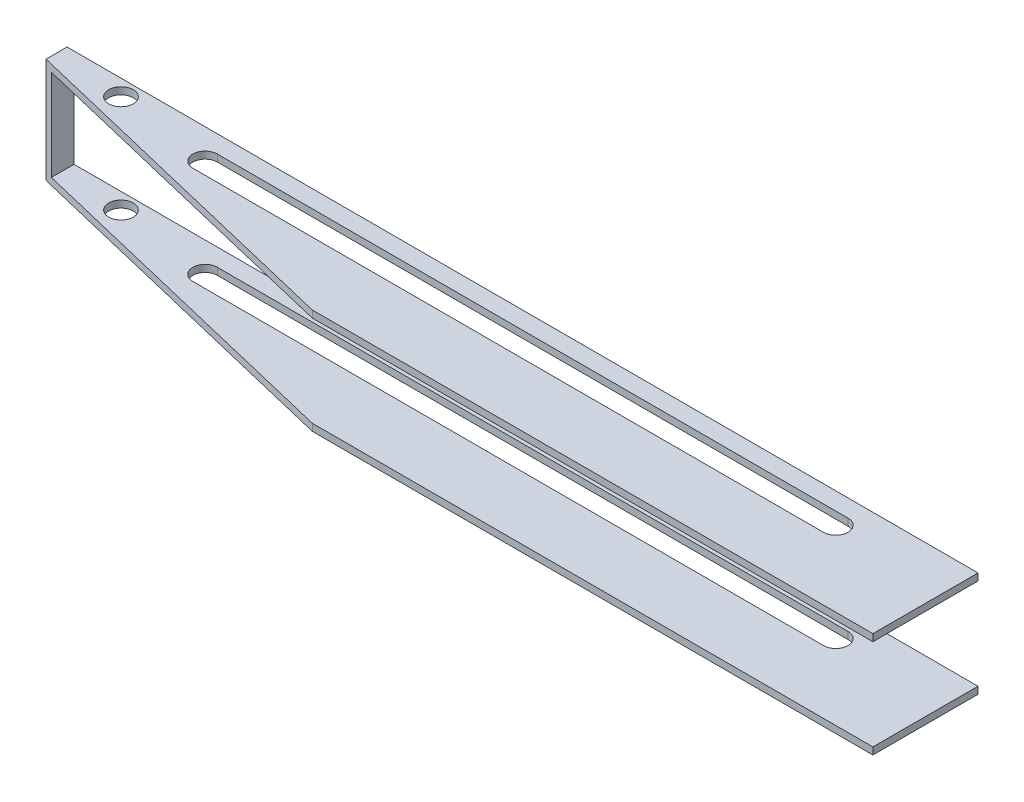
ISO-10303-21;
HEADER;
FILE_DESCRIPTION(('STEP AP214'),'2;1');
FILE_NAME('part.step','',(''),(''),'','','');
FILE_SCHEMA(('AUTOMOTIVE_DESIGN { 1 0 10303 214 1 1 1 1 }'));
ENDSEC;
DATA;
#1=APPLICATION_CONTEXT('core data for automotive mechanical design processes');
#2=APPLICATION_PROTOCOL_DEFINITION('international standard','automotive_design',2000,#1);
#3=PRODUCT_CONTEXT('',#1,'mechanical');
#4=PRODUCT('Part','Part','',(#3));
#5=PRODUCT_RELATED_PRODUCT_CATEGORY('part','',(#4));
#6=PRODUCT_DEFINITION_FORMATION('','',#4);
#7=PRODUCT_DEFINITION_CONTEXT('part definition',#1,'design');
#8=PRODUCT_DEFINITION('design','',#6,#7);
#9=PRODUCT_DEFINITION_SHAPE('','',#8);
#10=(LENGTH_UNIT() NAMED_UNIT(*) SI_UNIT(.MILLI.,.METRE.));
#11=(NAMED_UNIT(*) PLANE_ANGLE_UNIT() SI_UNIT($,.RADIAN.));
#12=(NAMED_UNIT(*) SI_UNIT($,.STERADIAN.) SOLID_ANGLE_UNIT());
#13=UNCERTAINTY_MEASURE_WITH_UNIT(LENGTH_MEASURE(1.E-05),#10,'distance_accuracy_value','');
#14=(GEOMETRIC_REPRESENTATION_CONTEXT(3) GLOBAL_UNCERTAINTY_ASSIGNED_CONTEXT((#13)) GLOBAL_UNIT_ASSIGNED_CONTEXT((#10,
#11,#12)) REPRESENTATION_CONTEXT('',''));
#15=CARTESIAN_POINT('',(0.,0.,0.));
#16=DIRECTION('',(0.,0.,1.));
#17=DIRECTION('',(1.,0.,0.));
#18=AXIS2_PLACEMENT_3D('',#15,#16,#17);
#19=CARTESIAN_POINT('',(0.,0.,0.));
#20=DIRECTION('',(0.,0.,-1.));
#21=DIRECTION('',(-1.,0.,0.));
#22=AXIS2_PLACEMENT_3D('',#19,#20,#21);
#23=PLANE('',#22);
#24=DIRECTION('',(-1.,0.,0.));
#25=VECTOR('',#24,1.);
#26=CARTESIAN_POINT('',(-60.5374077976817,-1.85985247629088,0.));
#27=LINE('',#26,#25);
#28=CARTESIAN_POINT('',(69.4625922023183,-1.85985247629088,0.));
#29=VERTEX_POINT('',#28);
#30=CARTESIAN_POINT('',(-10.5374077976817,-1.85985247629088,0.));
#31=VERTEX_POINT('',#30);
#32=EDGE_CURVE('E251',#29,#31,#27,.T.);
#33=ORIENTED_EDGE('',*,*,#32,.T.);
#34=DIRECTION('',(0.,-1.,0.));
#35=VECTOR('',#34,1.);
#36=CARTESIAN_POINT('',(-10.5374077976817,0.,0.));
#37=LINE('',#36,#35);
#38=CARTESIAN_POINT('',(-10.5374077976817,-2.85985247629089,0.));
#39=VERTEX_POINT('',#38);
#40=EDGE_CURVE('E11',#31,#39,#37,.T.);
#41=ORIENTED_EDGE('',*,*,#40,.T.);
#42=DIRECTION('',(1.,0.,0.));
#43=VECTOR('',#42,1.);
#44=CARTESIAN_POINT('',(69.4625922023183,-2.85985247629088,0.));
#45=LINE('',#44,#43);
#46=CARTESIAN_POINT('',(69.4625922023183,-2.85985247629088,0.));
#47=VERTEX_POINT('',#46);
#48=EDGE_CURVE('E280',#39,#47,#45,.T.);
#49=ORIENTED_EDGE('',*,*,#48,.T.);
#50=DIRECTION('',(0.,1.,0.));
#51=VECTOR('',#50,1.);
#52=CARTESIAN_POINT('',(69.4625922023183,-1.85985247629088,0.));
#53=LINE('',#52,#51);
#54=EDGE_CURVE('E282',#47,#29,#53,.T.);
#55=ORIENTED_EDGE('',*,*,#54,.T.);
#56=EDGE_LOOP('',(#33,#41,#49,#55));
#57=FACE_BOUND('',#56,.T.);
#58=ADVANCED_FACE('F33',(#57),#23,.F.);
#59=CARTESIAN_POINT('',(-60.5374077976817,-16.8598524762909,-15.));
#60=DIRECTION('',(-1.,0.,0.));
#61=DIRECTION('',(0.,0.,1.));
#62=AXIS2_PLACEMENT_3D('',#59,#60,#61);
#63=PLANE('',#62);
#64=DIRECTION('',(0.,1.,0.));
#65=VECTOR('',#64,1.);
#66=CARTESIAN_POINT('',(-60.5374077976817,-16.8598524762909,-12.));
#67=LINE('',#66,#65);
#68=CARTESIAN_POINT('',(-60.5374077976817,-16.8598524762909,-12.));
#69=VERTEX_POINT('',#68);
#70=CARTESIAN_POINT('',(-60.5374077976817,-1.85985247629088,-12.));
#71=VERTEX_POINT('',#70);
#72=EDGE_CURVE('E236',#69,#71,#67,.T.);
#73=ORIENTED_EDGE('',*,*,#72,.T.);
#74=DIRECTION('',(0.,0.,1.));
#75=VECTOR('',#74,1.);
#76=CARTESIAN_POINT('',(-60.5374077976817,-1.85985247629088,-15.));
#77=LINE('',#76,#75);
#78=CARTESIAN_POINT('',(-60.5374077976817,-1.85985247629088,-15.));
#79=VERTEX_POINT('',#78);
#80=EDGE_CURVE('E41',#79,#71,#77,.T.);
#81=ORIENTED_EDGE('',*,*,#80,.F.);
#82=DIRECTION('',(0.,-1.,0.));
#83=VECTOR('',#82,1.);
#84=CARTESIAN_POINT('',(-60.5374077976817,-16.8598524762909,-15.));
#85=LINE('',#84,#83);
#86=CARTESIAN_POINT('',(-60.5374077976817,-16.8598524762909,-15.));
#87=VERTEX_POINT('',#86);
#88=EDGE_CURVE('E247',#79,#87,#85,.T.);
#89=ORIENTED_EDGE('',*,*,#88,.T.);
#90=DIRECTION('',(0.,0.,1.));
#91=VECTOR('',#90,1.);
#92=CARTESIAN_POINT('',(-60.5374077976817,-16.8598524762909,-15.));
#93=LINE('',#92,#91);
#94=EDGE_CURVE('E272',#87,#69,#93,.T.);
#95=ORIENTED_EDGE('',*,*,#94,.T.);
#96=EDGE_LOOP('',(#73,#81,#89,#95));
#97=FACE_BOUND('',#96,.T.);
#98=ADVANCED_FACE('F35',(#97),#63,.T.);
#99=CARTESIAN_POINT('',(-60.5374077976817,-1.85985247629088,-15.));
#100=DIRECTION('',(0.,1.,0.));
#101=DIRECTION('',(0.,0.,1.));
#102=AXIS2_PLACEMENT_3D('',#99,#100,#101);
#103=PLANE('',#102);
#104=CARTESIAN_POINT('',(53.4154018775789,-1.85985247629086,-10.75));
#105=DIRECTION('',(0.,-1.,0.));
#106=DIRECTION('',(1.,0.,0.));
#107=AXIS2_PLACEMENT_3D('',#104,#105,#106);
#108=CIRCLE('',#107,1.75);
#109=CARTESIAN_POINT('',(53.4154018775789,-1.85985247629086,-12.5));
#110=VERTEX_POINT('',#109);
#111=CARTESIAN_POINT('',(53.4154018775789,-1.85985247629086,-9.));
#112=VERTEX_POINT('',#111);
#113=EDGE_CURVE('E161',#110,#112,#108,.T.);
#114=ORIENTED_EDGE('',*,*,#113,.T.);
#115=DIRECTION('',(-1.,0.,0.));
#116=VECTOR('',#115,1.);
#117=CARTESIAN_POINT('',(53.4154018775789,-1.85985247629086,-9.));
#118=LINE('',#117,#116);
#119=CARTESIAN_POINT('',(-36.5845981224211,-1.85985247629088,-9.00000000000001));
#120=VERTEX_POINT('',#119);
#121=EDGE_CURVE('E170',#112,#120,#118,.T.);
#122=ORIENTED_EDGE('',*,*,#121,.T.);
#123=CARTESIAN_POINT('',(-36.5845981224211,-1.85985247629088,-10.75));
#124=DIRECTION('',(0.,-1.,0.));
#125=DIRECTION('',(1.,0.,0.));
#126=AXIS2_PLACEMENT_3D('',#123,#124,#125);
#127=CIRCLE('',#126,1.75);
#128=CARTESIAN_POINT('',(-36.5845981224211,-1.85985247629088,-12.5));
#129=VERTEX_POINT('',#128);
#130=EDGE_CURVE('E48',#120,#129,#127,.T.);
#131=ORIENTED_EDGE('',*,*,#130,.T.);
#132=DIRECTION('',(1.,0.,0.));
#133=VECTOR('',#132,1.);
#134=CARTESIAN_POINT('',(53.4154018775789,-1.85985247629086,-12.5));
#135=LINE('',#134,#133);
#136=EDGE_CURVE('E178',#129,#110,#135,.T.);
#137=ORIENTED_EDGE('',*,*,#136,.T.);
#138=EDGE_LOOP('',(#114,#122,#131,#137));
#139=FACE_BOUND('',#138,.T.);
#140=CARTESIAN_POINT('',(-50.5374077976817,-1.85985247629088,-12.7));
#141=DIRECTION('',(0.,1.,0.));
#142=DIRECTION('',(0.,0.,1.));
#143=AXIS2_PLACEMENT_3D('',#140,#141,#142);
#144=CIRCLE('',#143,1.75);
#145=CARTESIAN_POINT('',(-50.5374077976817,-1.85985247629088,-10.95));
#146=VERTEX_POINT('',#145);
#147=EDGE_CURVE('E218',#146,#146,#144,.T.);
#148=ORIENTED_EDGE('',*,*,#147,.F.);
#149=EDGE_LOOP('',(#148));
#150=FACE_BOUND('',#149,.T.);
#151=DIRECTION('',(-0.972387301980517,0.,-0.233372952475324));
#152=VECTOR('',#151,1.);
#153=CARTESIAN_POINT('',(-60.5374077976817,-1.85985247629088,-12.));
#154=LINE('',#153,#152);
#155=EDGE_CURVE('E230',#31,#71,#154,.T.);
#156=ORIENTED_EDGE('',*,*,#155,.F.);
#157=ORIENTED_EDGE('',*,*,#32,.F.);
#158=DIRECTION('',(0.,0.,1.));
#159=VECTOR('',#158,1.);
#160=CARTESIAN_POINT('',(69.4625922023183,-1.85985247629088,-15.));
#161=LINE('',#160,#159);
#162=CARTESIAN_POINT('',(69.4625922023183,-1.85985247629088,-15.));
#163=VERTEX_POINT('',#162);
#164=EDGE_CURVE('E289',#163,#29,#161,.T.);
#165=ORIENTED_EDGE('',*,*,#164,.F.);
#166=DIRECTION('',(-1.,0.,0.));
#167=VECTOR('',#166,1.);
#168=CARTESIAN_POINT('',(-60.5374077976817,-1.85985247629088,-15.));
#169=LINE('',#168,#167);
#170=EDGE_CURVE('E269',#163,#79,#169,.T.);
#171=ORIENTED_EDGE('',*,*,#170,.T.);
#172=ORIENTED_EDGE('',*,*,#80,.T.);
#173=EDGE_LOOP('',(#156,#157,#165,#171,#172));
#174=FACE_BOUND('',#173,.T.);
#175=ADVANCED_FACE('F175',(#139,#150,#174),#103,.T.);
#176=CARTESIAN_POINT('',(69.4625922023183,-1.85985247629088,-15.));
#177=DIRECTION('',(1.,0.,0.));
#178=DIRECTION('',(0.,0.,-1.));
#179=AXIS2_PLACEMENT_3D('',#176,#177,#178);
#180=PLANE('',#179);
#181=ORIENTED_EDGE('',*,*,#54,.F.);
#182=DIRECTION('',(0.,0.,1.));
#183=VECTOR('',#182,1.);
#184=CARTESIAN_POINT('',(69.4625922023183,-2.85985247629088,-15.));
#185=LINE('',#184,#183);
#186=CARTESIAN_POINT('',(69.4625922023183,-2.85985247629088,-15.));
#187=VERTEX_POINT('',#186);
#188=EDGE_CURVE('E291',#187,#47,#185,.T.);
#189=ORIENTED_EDGE('',*,*,#188,.F.);
#190=DIRECTION('',(0.,1.,0.));
#191=VECTOR('',#190,1.);
#192=CARTESIAN_POINT('',(69.4625922023183,-1.85985247629088,-15.));
#193=LINE('',#192,#191);
#194=EDGE_CURVE('E266',#187,#163,#193,.T.);
#195=ORIENTED_EDGE('',*,*,#194,.T.);
#196=ORIENTED_EDGE('',*,*,#164,.T.);
#197=EDGE_LOOP('',(#181,#189,#195,#196));
#198=FACE_BOUND('',#197,.T.);
#199=ADVANCED_FACE('F344',(#198),#180,.T.);
#200=CARTESIAN_POINT('',(69.4625922023183,-2.85985247629088,-15.));
#201=DIRECTION('',(0.,-1.,0.));
#202=DIRECTION('',(1.,0.,0.));
#203=AXIS2_PLACEMENT_3D('',#200,#201,#202);
#204=PLANE('',#203);
#205=CARTESIAN_POINT('',(53.4154018775789,-2.85985247629088,-10.75));
#206=DIRECTION('',(0.,-1.,0.));
#207=DIRECTION('',(1.,0.,0.));
#208=AXIS2_PLACEMENT_3D('',#205,#206,#207);
#209=CIRCLE('',#208,1.75);
#210=CARTESIAN_POINT('',(53.4154018775789,-2.85985247629088,-12.5));
#211=VERTEX_POINT('',#210);
#212=CARTESIAN_POINT('',(53.4154018775789,-2.85985247629088,-9.));
#213=VERTEX_POINT('',#212);
#214=EDGE_CURVE('E164',#211,#213,#209,.T.);
#215=ORIENTED_EDGE('',*,*,#214,.F.);
#216=DIRECTION('',(1.,0.,0.));
#217=VECTOR('',#216,1.);
#218=CARTESIAN_POINT('',(69.4625922023183,-2.85985247629088,-12.5));
#219=LINE('',#218,#217);
#220=CARTESIAN_POINT('',(-36.5845981224211,-2.85985247629089,-12.5));
#221=VERTEX_POINT('',#220);
#222=EDGE_CURVE('E213',#221,#211,#219,.T.);
#223=ORIENTED_EDGE('',*,*,#222,.F.);
#224=CARTESIAN_POINT('',(-36.5845981224211,-2.85985247629089,-10.75));
#225=DIRECTION('',(0.,-1.,0.));
#226=DIRECTION('',(1.,0.,0.));
#227=AXIS2_PLACEMENT_3D('',#224,#225,#226);
#228=CIRCLE('',#227,1.75);
#229=CARTESIAN_POINT('',(-36.5845981224211,-2.85985247629088,-9.00000000000001));
#230=VERTEX_POINT('',#229);
#231=EDGE_CURVE('E209',#230,#221,#228,.T.);
#232=ORIENTED_EDGE('',*,*,#231,.F.);
#233=DIRECTION('',(-1.,0.,0.));
#234=VECTOR('',#233,1.);
#235=CARTESIAN_POINT('',(69.4625922023183,-2.85985247629088,-9.));
#236=LINE('',#235,#234);
#237=EDGE_CURVE('E204',#213,#230,#236,.T.);
#238=ORIENTED_EDGE('',*,*,#237,.F.);
#239=EDGE_LOOP('',(#215,#223,#232,#238));
#240=FACE_BOUND('',#239,.T.);
#241=CARTESIAN_POINT('',(-50.5374077976817,-2.85985247629089,-12.7));
#242=DIRECTION('',(0.,-1.,0.));
#243=DIRECTION('',(1.,0.,0.));
#244=AXIS2_PLACEMENT_3D('',#241,#242,#243);
#245=CIRCLE('',#244,1.75);
#246=CARTESIAN_POINT('',(-50.5374077976817,-2.85985247629089,-10.95));
#247=VERTEX_POINT('',#246);
#248=EDGE_CURVE('E227',#247,#247,#245,.T.);
#249=ORIENTED_EDGE('',*,*,#248,.F.);
#250=EDGE_LOOP('',(#249));
#251=FACE_BOUND('',#250,.T.);
#252=DIRECTION('',(0.972387301980517,0.,0.233372952475324));
#253=VECTOR('',#252,1.);
#254=CARTESIAN_POINT('',(61.7016239723636,-2.85985247629088,17.3373676248109));
#255=LINE('',#254,#253);
#256=CARTESIAN_POINT('',(-59.5374077976817,-2.85985247629089,-11.76));
#257=VERTEX_POINT('',#256);
#258=EDGE_CURVE('E244',#257,#39,#255,.T.);
#259=ORIENTED_EDGE('',*,*,#258,.F.);
#260=DIRECTION('',(0.,0.,1.));
#261=VECTOR('',#260,1.);
#262=CARTESIAN_POINT('',(-59.5374077976817,-2.85985247629089,-15.));
#263=LINE('',#262,#261);
#264=CARTESIAN_POINT('',(-59.5374077976817,-2.85985247629089,-15.));
#265=VERTEX_POINT('',#264);
#266=EDGE_CURVE('E294',#265,#257,#263,.T.);
#267=ORIENTED_EDGE('',*,*,#266,.F.);
#268=DIRECTION('',(1.,0.,0.));
#269=VECTOR('',#268,1.);
#270=CARTESIAN_POINT('',(69.4625922023183,-2.85985247629088,-15.));
#271=LINE('',#270,#269);
#272=EDGE_CURVE('E263',#265,#187,#271,.T.);
#273=ORIENTED_EDGE('',*,*,#272,.T.);
#274=ORIENTED_EDGE('',*,*,#188,.T.);
#275=ORIENTED_EDGE('',*,*,#48,.F.);
#276=EDGE_LOOP('',(#259,#267,#273,#274,#275));
#277=FACE_BOUND('',#276,.T.);
#278=ADVANCED_FACE('F336',(#240,#251,#277),#204,.T.);
#279=CARTESIAN_POINT('',(-59.5374077976817,-2.85985247629089,-15.));
#280=DIRECTION('',(1.,0.,0.));
#281=DIRECTION('',(0.,1.,0.));
#282=AXIS2_PLACEMENT_3D('',#279,#280,#281);
#283=PLANE('',#282);
#284=DIRECTION('',(0.,1.,0.));
#285=VECTOR('',#284,1.);
#286=CARTESIAN_POINT('',(-59.5374077976817,-2.85985247629089,-11.76));
#287=LINE('',#286,#285);
#288=CARTESIAN_POINT('',(-59.5374077976817,-15.8598524762909,-11.76));
#289=VERTEX_POINT('',#288);
#290=EDGE_CURVE('E242',#289,#257,#287,.T.);
#291=ORIENTED_EDGE('',*,*,#290,.F.);
#292=DIRECTION('',(0.,0.,1.));
#293=VECTOR('',#292,1.);
#294=CARTESIAN_POINT('',(-59.5374077976817,-15.8598524762909,-15.));
#295=LINE('',#294,#293);
#296=CARTESIAN_POINT('',(-59.5374077976817,-15.8598524762909,-15.));
#297=VERTEX_POINT('',#296);
#298=EDGE_CURVE('E297',#297,#289,#295,.T.);
#299=ORIENTED_EDGE('',*,*,#298,.F.);
#300=DIRECTION('',(0.,1.,0.));
#301=VECTOR('',#300,1.);
#302=CARTESIAN_POINT('',(-59.5374077976817,-2.85985247629089,-15.));
#303=LINE('',#302,#301);
#304=EDGE_CURVE('E260',#297,#265,#303,.T.);
#305=ORIENTED_EDGE('',*,*,#304,.T.);
#306=ORIENTED_EDGE('',*,*,#266,.T.);
#307=EDGE_LOOP('',(#291,#299,#305,#306));
#308=FACE_BOUND('',#307,.T.);
#309=ADVANCED_FACE('F331',(#308),#283,.T.);
#310=CARTESIAN_POINT('',(-59.5374077976817,-15.8598524762909,-15.));
#311=DIRECTION('',(0.,1.,0.));
#312=DIRECTION('',(0.,0.,1.));
#313=AXIS2_PLACEMENT_3D('',#310,#311,#312);
#314=PLANE('',#313);
#315=CARTESIAN_POINT('',(53.4154018775789,-15.8598524762909,-10.75));
#316=DIRECTION('',(0.,1.,0.));
#317=DIRECTION('',(0.,0.,1.));
#318=AXIS2_PLACEMENT_3D('',#315,#316,#317);
#319=CIRCLE('',#318,1.75);
#320=CARTESIAN_POINT('',(53.4154018775789,-15.8598524762909,-9.));
#321=VERTEX_POINT('',#320);
#322=CARTESIAN_POINT('',(53.4154018775789,-15.8598524762909,-12.5));
#323=VERTEX_POINT('',#322);
#324=EDGE_CURVE('E215',#321,#323,#319,.T.);
#325=ORIENTED_EDGE('',*,*,#324,.F.);
#326=DIRECTION('',(1.,0.,0.));
#327=VECTOR('',#326,1.);
#328=CARTESIAN_POINT('',(-59.5374077976817,-15.8598524762909,-9.00000000000001));
#329=LINE('',#328,#327);
#330=CARTESIAN_POINT('',(-36.5845981224211,-15.8598524762909,-9.00000000000001));
#331=VERTEX_POINT('',#330);
#332=EDGE_CURVE('E196',#331,#321,#329,.T.);
#333=ORIENTED_EDGE('',*,*,#332,.F.);
#334=CARTESIAN_POINT('',(-36.5845981224211,-15.8598524762909,-10.75));
#335=DIRECTION('',(0.,1.,0.));
#336=DIRECTION('',(0.,0.,1.));
#337=AXIS2_PLACEMENT_3D('',#334,#335,#336);
#338=CIRCLE('',#337,1.75);
#339=CARTESIAN_POINT('',(-36.5845981224211,-15.8598524762909,-12.5));
#340=VERTEX_POINT('',#339);
#341=EDGE_CURVE('E206',#340,#331,#338,.T.);
#342=ORIENTED_EDGE('',*,*,#341,.F.);
#343=DIRECTION('',(-1.,0.,0.));
#344=VECTOR('',#343,1.);
#345=CARTESIAN_POINT('',(-59.5374077976817,-15.8598524762909,-12.5));
#346=LINE('',#345,#344);
#347=EDGE_CURVE('E211',#323,#340,#346,.T.);
#348=ORIENTED_EDGE('',*,*,#347,.F.);
#349=EDGE_LOOP('',(#325,#333,#342,#348));
#350=FACE_BOUND('',#349,.T.);
#351=CARTESIAN_POINT('',(-50.5374077976817,-15.8598524762909,-12.7));
#352=DIRECTION('',(0.,1.,0.));
#353=DIRECTION('',(0.,0.,1.));
#354=AXIS2_PLACEMENT_3D('',#351,#352,#353);
#355=CIRCLE('',#354,1.75);
#356=CARTESIAN_POINT('',(-50.5374077976817,-15.8598524762909,-10.95));
#357=VERTEX_POINT('',#356);
#358=EDGE_CURVE('E222',#357,#357,#355,.T.);
#359=ORIENTED_EDGE('',*,*,#358,.F.);
#360=EDGE_LOOP('',(#359));
#361=FACE_BOUND('',#360,.T.);
#362=DIRECTION('',(-0.972387301980517,0.,-0.233372952475324));
#363=VECTOR('',#362,1.);
#364=CARTESIAN_POINT('',(-60.2726574194669,-15.8598524762909,-11.9364599092284));
#365=LINE('',#364,#363);
#366=CARTESIAN_POINT('',(-10.5374077976817,-15.8598524762909,0.));
#367=VERTEX_POINT('',#366);
#368=EDGE_CURVE('E239',#367,#289,#365,.T.);
#369=ORIENTED_EDGE('',*,*,#368,.F.);
#370=DIRECTION('',(-1.,0.,0.));
#371=VECTOR('',#370,1.);
#372=CARTESIAN_POINT('',(-59.5374077976817,-15.8598524762909,0.));
#373=LINE('',#372,#371);
#374=CARTESIAN_POINT('',(69.4625922023182,-15.8598524762909,0.));
#375=VERTEX_POINT('',#374);
#376=EDGE_CURVE('E277',#375,#367,#373,.T.);
#377=ORIENTED_EDGE('',*,*,#376,.F.);
#378=DIRECTION('',(0.,0.,1.));
#379=VECTOR('',#378,1.);
#380=CARTESIAN_POINT('',(69.4625922023182,-15.8598524762909,-15.));
#381=LINE('',#380,#379);
#382=CARTESIAN_POINT('',(69.4625922023182,-15.8598524762909,-15.));
#383=VERTEX_POINT('',#382);
#384=EDGE_CURVE('E300',#383,#375,#381,.T.);
#385=ORIENTED_EDGE('',*,*,#384,.F.);
#386=DIRECTION('',(-1.,0.,0.));
#387=VECTOR('',#386,1.);
#388=CARTESIAN_POINT('',(-59.5374077976817,-15.8598524762909,-15.));
#389=LINE('',#388,#387);
#390=EDGE_CURVE('E257',#383,#297,#389,.T.);
#391=ORIENTED_EDGE('',*,*,#390,.T.);
#392=ORIENTED_EDGE('',*,*,#298,.T.);
#393=EDGE_LOOP('',(#369,#377,#385,#391,#392));
#394=FACE_BOUND('',#393,.T.);
#395=ADVANCED_FACE('F329',(#350,#361,#394),#314,.T.);
#396=CARTESIAN_POINT('',(69.4625922023182,-15.8598524762909,-15.));
#397=DIRECTION('',(1.,0.,0.));
#398=DIRECTION('',(0.,1.,0.));
#399=AXIS2_PLACEMENT_3D('',#396,#397,#398);
#400=PLANE('',#399);
#401=DIRECTION('',(0.,1.,0.));
#402=VECTOR('',#401,1.);
#403=CARTESIAN_POINT('',(69.4625922023182,-15.8598524762909,0.));
#404=LINE('',#403,#402);
#405=CARTESIAN_POINT('',(69.4625922023183,-16.8598524762909,0.));
#406=VERTEX_POINT('',#405);
#407=EDGE_CURVE('E274',#406,#375,#404,.T.);
#408=ORIENTED_EDGE('',*,*,#407,.F.);
#409=DIRECTION('',(0.,0.,1.));
#410=VECTOR('',#409,1.);
#411=CARTESIAN_POINT('',(69.4625922023183,-16.8598524762909,-15.));
#412=LINE('',#411,#410);
#413=CARTESIAN_POINT('',(69.4625922023183,-16.8598524762909,-15.));
#414=VERTEX_POINT('',#413);
#415=EDGE_CURVE('E302',#414,#406,#412,.T.);
#416=ORIENTED_EDGE('',*,*,#415,.F.);
#417=DIRECTION('',(0.,1.,0.));
#418=VECTOR('',#417,1.);
#419=CARTESIAN_POINT('',(69.4625922023182,-15.8598524762909,-15.));
#420=LINE('',#419,#418);
#421=EDGE_CURVE('E254',#414,#383,#420,.T.);
#422=ORIENTED_EDGE('',*,*,#421,.T.);
#423=ORIENTED_EDGE('',*,*,#384,.T.);
#424=EDGE_LOOP('',(#408,#416,#422,#423));
#425=FACE_BOUND('',#424,.T.);
#426=ADVANCED_FACE('F319',(#425),#400,.T.);
#427=CARTESIAN_POINT('',(69.4625922023183,-16.8598524762909,-15.));
#428=DIRECTION('',(0.,-1.,0.));
#429=DIRECTION('',(1.,0.,0.));
#430=AXIS2_PLACEMENT_3D('',#427,#428,#429);
#431=PLANE('',#430);
#432=CARTESIAN_POINT('',(53.4154018775789,-16.8598524762909,-10.75));
#433=DIRECTION('',(0.,-1.,0.));
#434=DIRECTION('',(1.,0.,0.));
#435=AXIS2_PLACEMENT_3D('',#432,#433,#434);
#436=CIRCLE('',#435,1.75);
#437=CARTESIAN_POINT('',(53.4154018775789,-16.8598524762909,-12.5));
#438=VERTEX_POINT('',#437);
#439=CARTESIAN_POINT('',(53.4154018775789,-16.8598524762909,-9.));
#440=VERTEX_POINT('',#439);
#441=EDGE_CURVE('E187',#438,#440,#436,.T.);
#442=ORIENTED_EDGE('',*,*,#441,.F.);
#443=DIRECTION('',(1.,0.,0.));
#444=VECTOR('',#443,1.);
#445=CARTESIAN_POINT('',(53.4154018775789,-16.8598524762909,-12.5));
#446=LINE('',#445,#444);
#447=CARTESIAN_POINT('',(-36.5845981224211,-16.8598524762909,-12.5));
#448=VERTEX_POINT('',#447);
#449=EDGE_CURVE('E179',#448,#438,#446,.T.);
#450=ORIENTED_EDGE('',*,*,#449,.F.);
#451=CARTESIAN_POINT('',(-36.5845981224211,-16.8598524762909,-10.75));
#452=DIRECTION('',(0.,-1.,0.));
#453=DIRECTION('',(1.,0.,0.));
#454=AXIS2_PLACEMENT_3D('',#451,#452,#453);
#455=CIRCLE('',#454,1.75);
#456=CARTESIAN_POINT('',(-36.5845981224211,-16.8598524762909,-9.00000000000001));
#457=VERTEX_POINT('',#456);
#458=EDGE_CURVE('E182',#457,#448,#455,.T.);
#459=ORIENTED_EDGE('',*,*,#458,.F.);
#460=DIRECTION('',(-1.,0.,0.));
#461=VECTOR('',#460,1.);
#462=CARTESIAN_POINT('',(53.4154018775789,-16.8598524762909,-9.));
#463=LINE('',#462,#461);
#464=EDGE_CURVE('E189',#440,#457,#463,.T.);
#465=ORIENTED_EDGE('',*,*,#464,.F.);
#466=EDGE_LOOP('',(#442,#450,#459,#465));
#467=FACE_BOUND('',#466,.T.);
#468=CARTESIAN_POINT('',(-50.5374077976817,-16.8598524762909,-12.7));
#469=DIRECTION('',(0.,1.,0.));
#470=DIRECTION('',(0.,0.,1.));
#471=AXIS2_PLACEMENT_3D('',#468,#469,#470);
#472=CIRCLE('',#471,1.75);
#473=CARTESIAN_POINT('',(-50.5374077976817,-16.8598524762909,-10.95));
#474=VERTEX_POINT('',#473);
#475=EDGE_CURVE('E219',#474,#474,#472,.T.);
#476=ORIENTED_EDGE('',*,*,#475,.T.);
#477=EDGE_LOOP('',(#476));
#478=FACE_BOUND('',#477,.T.);
#479=DIRECTION('',(-0.972387301980517,0.,-0.233372952475324));
#480=VECTOR('',#479,1.);
#481=CARTESIAN_POINT('',(-60.5374077976817,-16.8598524762909,-12.));
#482=LINE('',#481,#480);
#483=CARTESIAN_POINT('',(-10.5374077976817,-16.8598524762909,0.));
#484=VERTEX_POINT('',#483);
#485=EDGE_CURVE('E231',#484,#69,#482,.T.);
#486=ORIENTED_EDGE('',*,*,#485,.T.);
#487=ORIENTED_EDGE('',*,*,#94,.F.);
#488=DIRECTION('',(1.,0.,0.));
#489=VECTOR('',#488,1.);
#490=CARTESIAN_POINT('',(69.4625922023183,-16.8598524762909,-15.));
#491=LINE('',#490,#489);
#492=EDGE_CURVE('E250',#87,#414,#491,.T.);
#493=ORIENTED_EDGE('',*,*,#492,.T.);
#494=ORIENTED_EDGE('',*,*,#415,.T.);
#495=DIRECTION('',(1.,0.,0.));
#496=VECTOR('',#495,1.);
#497=CARTESIAN_POINT('',(69.4625922023183,-16.8598524762909,0.));
#498=LINE('',#497,#496);
#499=EDGE_CURVE('E246',#484,#406,#498,.T.);
#500=ORIENTED_EDGE('',*,*,#499,.F.);
#501=EDGE_LOOP('',(#486,#487,#493,#494,#500));
#502=FACE_BOUND('',#501,.T.);
#503=ADVANCED_FACE('F309',(#467,#478,#502),#431,.T.);
#504=CARTESIAN_POINT('',(0.,0.,-15.));
#505=DIRECTION('',(0.,0.,-1.));
#506=DIRECTION('',(-1.,0.,0.));
#507=AXIS2_PLACEMENT_3D('',#504,#505,#506);
#508=PLANE('',#507);
#509=ORIENTED_EDGE('',*,*,#88,.F.);
#510=ORIENTED_EDGE('',*,*,#170,.F.);
#511=ORIENTED_EDGE('',*,*,#194,.F.);
#512=ORIENTED_EDGE('',*,*,#272,.F.);
#513=ORIENTED_EDGE('',*,*,#304,.F.);
#514=ORIENTED_EDGE('',*,*,#390,.F.);
#515=ORIENTED_EDGE('',*,*,#421,.F.);
#516=ORIENTED_EDGE('',*,*,#492,.F.);
#517=EDGE_LOOP('',(#509,#510,#511,#512,#513,#514,#515,#516));
#518=FACE_BOUND('',#517,.T.);
#519=ADVANCED_FACE('F313',(#518),#508,.T.);
#520=ORIENTED_EDGE('',*,*,#376,.T.);
#521=DIRECTION('',(0.,1.,0.));
#522=VECTOR('',#521,1.);
#523=CARTESIAN_POINT('',(-10.5374077976817,-16.8598524762909,0.));
#524=LINE('',#523,#522);
#525=EDGE_CURVE('E234',#484,#367,#524,.T.);
#526=ORIENTED_EDGE('',*,*,#525,.F.);
#527=ORIENTED_EDGE('',*,*,#499,.T.);
#528=ORIENTED_EDGE('',*,*,#407,.T.);
#529=EDGE_LOOP('',(#520,#526,#527,#528));
#530=FACE_BOUND('',#529,.T.);
#531=ADVANCED_FACE('F323',(#530),#23,.F.);
#532=CARTESIAN_POINT('',(-60.5374077976817,-16.8598524762909,-12.));
#533=DIRECTION('',(0.233372952475324,0.,-0.972387301980517));
#534=DIRECTION('',(-0.972387301980517,0.,-0.233372952475324));
#535=AXIS2_PLACEMENT_3D('',#532,#533,#534);
#536=PLANE('',#535);
#537=ORIENTED_EDGE('',*,*,#258,.T.);
#538=ORIENTED_EDGE('',*,*,#40,.F.);
#539=ORIENTED_EDGE('',*,*,#155,.T.);
#540=ORIENTED_EDGE('',*,*,#72,.F.);
#541=ORIENTED_EDGE('',*,*,#485,.F.);
#542=ORIENTED_EDGE('',*,*,#525,.T.);
#543=ORIENTED_EDGE('',*,*,#368,.T.);
#544=ORIENTED_EDGE('',*,*,#290,.T.);
#545=EDGE_LOOP('',(#537,#538,#539,#540,#541,#542,#543,#544));
#546=FACE_BOUND('',#545,.T.);
#547=ADVANCED_FACE('F326',(#546),#536,.F.);
#548=CARTESIAN_POINT('',(-50.5374077976817,-16.8598524762909,-12.7));
#549=DIRECTION('',(0.,1.,0.));
#550=DIRECTION('',(0.,0.,1.));
#551=AXIS2_PLACEMENT_3D('',#548,#549,#550);
#552=CYLINDRICAL_SURFACE('',#551,1.75);
#553=CARTESIAN_POINT('',(-50.5374077976817,-15.8598524762909,-10.95));
#554=CARTESIAN_POINT('',(-50.5374077976817,-15.8702691429575,-10.95));
#555=CARTESIAN_POINT('',(-50.5374077976817,-15.8806858096242,-10.95));
#556=CARTESIAN_POINT('',(-50.5374077976817,-15.9015191429575,-10.95));
#557=CARTESIAN_POINT('',(-50.5374077976817,-15.9119358096242,-10.95));
#558=CARTESIAN_POINT('',(-50.5374077976817,-15.9327691429575,-10.95));
#559=CARTESIAN_POINT('',(-50.5374077976817,-15.9431858096242,-10.95));
#560=CARTESIAN_POINT('',(-50.5374077976817,-15.9640191429575,-10.95));
#561=CARTESIAN_POINT('',(-50.5374077976817,-15.9744358096242,-10.95));
#562=CARTESIAN_POINT('',(-50.5374077976817,-15.9952691429575,-10.95));
#563=CARTESIAN_POINT('',(-50.5374077976817,-16.0056858096242,-10.95));
#564=CARTESIAN_POINT('',(-50.5374077976817,-16.0265191429575,-10.95));
#565=CARTESIAN_POINT('',(-50.5374077976817,-16.0369358096242,-10.95));
#566=CARTESIAN_POINT('',(-50.5374077976817,-16.0577691429575,-10.95));
#567=CARTESIAN_POINT('',(-50.5374077976817,-16.0681858096242,-10.95));
#568=CARTESIAN_POINT('',(-50.5374077976817,-16.0890191429575,-10.95));
#569=CARTESIAN_POINT('',(-50.5374077976817,-16.0994358096242,-10.95));
#570=CARTESIAN_POINT('',(-50.5374077976817,-16.1202691429575,-10.95));
#571=CARTESIAN_POINT('',(-50.5374077976817,-16.1306858096242,-10.95));
#572=CARTESIAN_POINT('',(-50.5374077976817,-16.1515191429575,-10.95));
#573=CARTESIAN_POINT('',(-50.5374077976817,-16.1619358096242,-10.95));
#574=CARTESIAN_POINT('',(-50.5374077976817,-16.1827691429575,-10.95));
#575=CARTESIAN_POINT('',(-50.5374077976817,-16.1931858096242,-10.95));
#576=CARTESIAN_POINT('',(-50.5374077976817,-16.2140191429575,-10.95));
#577=CARTESIAN_POINT('',(-50.5374077976817,-16.2244358096242,-10.95));
#578=CARTESIAN_POINT('',(-50.5374077976817,-16.2452691429575,-10.95));
#579=CARTESIAN_POINT('',(-50.5374077976817,-16.2556858096242,-10.95));
#580=CARTESIAN_POINT('',(-50.5374077976817,-16.2765191429575,-10.95));
#581=CARTESIAN_POINT('',(-50.5374077976817,-16.2869358096242,-10.95));
#582=CARTESIAN_POINT('',(-50.5374077976817,-16.3077691429575,-10.95));
#583=CARTESIAN_POINT('',(-50.5374077976817,-16.3181858096242,-10.95));
#584=CARTESIAN_POINT('',(-50.5374077976817,-16.3390191429575,-10.95));
#585=CARTESIAN_POINT('',(-50.5374077976817,-16.3494358096242,-10.95));
#586=CARTESIAN_POINT('',(-50.5374077976817,-16.3702691429575,-10.95));
#587=CARTESIAN_POINT('',(-50.5374077976817,-16.3806858096242,-10.95));
#588=CARTESIAN_POINT('',(-50.5374077976817,-16.4015191429575,-10.95));
#589=CARTESIAN_POINT('',(-50.5374077976817,-16.4119358096242,-10.95));
#590=CARTESIAN_POINT('',(-50.5374077976817,-16.4327691429575,-10.95));
#591=CARTESIAN_POINT('',(-50.5374077976817,-16.4431858096242,-10.95));
#592=CARTESIAN_POINT('',(-50.5374077976817,-16.4640191429575,-10.95));
#593=CARTESIAN_POINT('',(-50.5374077976817,-16.4744358096242,-10.95));
#594=CARTESIAN_POINT('',(-50.5374077976817,-16.4952691429575,-10.95));
#595=CARTESIAN_POINT('',(-50.5374077976817,-16.5056858096242,-10.95));
#596=CARTESIAN_POINT('',(-50.5374077976817,-16.5265191429575,-10.95));
#597=CARTESIAN_POINT('',(-50.5374077976817,-16.5369358096242,-10.95));
#598=CARTESIAN_POINT('',(-50.5374077976817,-16.5577691429575,-10.95));
#599=CARTESIAN_POINT('',(-50.5374077976817,-16.5681858096242,-10.95));
#600=CARTESIAN_POINT('',(-50.5374077976817,-16.5890191429575,-10.95));
#601=CARTESIAN_POINT('',(-50.5374077976817,-16.5994358096242,-10.95));
#602=CARTESIAN_POINT('',(-50.5374077976817,-16.6202691429575,-10.95));
#603=CARTESIAN_POINT('',(-50.5374077976817,-16.6306858096242,-10.95));
#604=CARTESIAN_POINT('',(-50.5374077976817,-16.6515191429575,-10.95));
#605=CARTESIAN_POINT('',(-50.5374077976817,-16.6619358096242,-10.95));
#606=CARTESIAN_POINT('',(-50.5374077976817,-16.6827691429575,-10.95));
#607=CARTESIAN_POINT('',(-50.5374077976817,-16.6931858096242,-10.95));
#608=CARTESIAN_POINT('',(-50.5374077976817,-16.7140191429575,-10.95));
#609=CARTESIAN_POINT('',(-50.5374077976817,-16.7244358096242,-10.95));
#610=CARTESIAN_POINT('',(-50.5374077976817,-16.7452691429575,-10.95));
#611=CARTESIAN_POINT('',(-50.5374077976817,-16.7556858096242,-10.95));
#612=CARTESIAN_POINT('',(-50.5374077976817,-16.7765191429575,-10.95));
#613=CARTESIAN_POINT('',(-50.5374077976817,-16.7869358096242,-10.95));
#614=CARTESIAN_POINT('',(-50.5374077976817,-16.8077691429575,-10.95));
#615=CARTESIAN_POINT('',(-50.5374077976817,-16.8181858096242,-10.95));
#616=CARTESIAN_POINT('',(-50.5374077976817,-16.8390191429575,-10.95));
#617=CARTESIAN_POINT('',(-50.5374077976817,-16.8494358096242,-10.95));
#618=CARTESIAN_POINT('',(-50.5374077976817,-16.8598524762909,-10.95));
#619=B_SPLINE_CURVE_WITH_KNOTS('',3,(#553,#554,#555,#556,#557,#558,#559,#560,#561,#562,#563,
#564,#565,#566,#567,#568,#569,#570,#571,#572,#573,#574,#575,#576,#577,#578,#579,#580,#581,#582,
#583,#584,#585,#586,#587,#588,#589,#590,#591,#592,#593,#594,#595,#596,#597,#598,#599,#600,#601,
#602,#603,#604,#605,#606,#607,#608,#609,#610,#611,#612,#613,#614,#615,#616,#617,#618),
.UNSPECIFIED.,.F.,.F.,(4,2,2,2,2,2,2,2,2,2,2,2,2,2,2,2,2,2,2,2,2,2,2,2,2,2,2,2,2,2,2,2,4),(0.,
0.03125,0.0625000000000001,0.0937500000000001,0.125,0.15625,0.1875,0.21875,0.25,0.28125,0.3125,
0.34375,0.375,0.40625,0.4375,0.46875,0.5,0.53125,0.5625,0.593750000000001,0.625000000000001,
0.656250000000001,0.687500000000001,0.718750000000001,0.750000000000001,0.781250000000001,
0.812500000000001,0.843750000000001,0.875000000000001,0.906250000000001,0.937500000000001,
0.968750000000001,0.999999999999997),.UNSPECIFIED.);
#620=EDGE_CURVE('BSEAM365',#357,#474,#619,.T.);
#621=ORIENTED_EDGE('',*,*,#358,.T.);
#622=ORIENTED_EDGE('',*,*,#475,.F.);
#623=ORIENTED_EDGE('',*,*,#620,.T.);
#624=ORIENTED_EDGE('',*,*,#620,.F.);
#625=EDGE_LOOP('',(#621,#623,#622,#624));
#626=FACE_BOUND('',#625,.T.);
#627=ADVANCED_FACE('F365',(#626),#552,.F.);
#628=CARTESIAN_POINT('',(-50.5374077976817,-2.85985247629089,-10.95));
#629=CARTESIAN_POINT('',(-50.5374077976817,-2.84943580962422,-10.95));
#630=CARTESIAN_POINT('',(-50.5374077976817,-2.83901914295756,-10.95));
#631=CARTESIAN_POINT('',(-50.5374077976817,-2.81818580962422,-10.95));
#632=CARTESIAN_POINT('',(-50.5374077976817,-2.80776914295756,-10.95));
#633=CARTESIAN_POINT('',(-50.5374077976817,-2.78693580962422,-10.95));
#634=CARTESIAN_POINT('',(-50.5374077976817,-2.77651914295756,-10.95));
#635=CARTESIAN_POINT('',(-50.5374077976817,-2.75568580962422,-10.95));
#636=CARTESIAN_POINT('',(-50.5374077976817,-2.74526914295756,-10.95));
#637=CARTESIAN_POINT('',(-50.5374077976817,-2.72443580962422,-10.95));
#638=CARTESIAN_POINT('',(-50.5374077976817,-2.71401914295756,-10.95));
#639=CARTESIAN_POINT('',(-50.5374077976817,-2.69318580962422,-10.95));
#640=CARTESIAN_POINT('',(-50.5374077976817,-2.68276914295755,-10.95));
#641=CARTESIAN_POINT('',(-50.5374077976817,-2.66193580962422,-10.95));
#642=CARTESIAN_POINT('',(-50.5374077976817,-2.65151914295755,-10.95));
#643=CARTESIAN_POINT('',(-50.5374077976817,-2.63068580962422,-10.95));
#644=CARTESIAN_POINT('',(-50.5374077976817,-2.62026914295755,-10.95));
#645=CARTESIAN_POINT('',(-50.5374077976817,-2.59943580962422,-10.95));
#646=CARTESIAN_POINT('',(-50.5374077976817,-2.58901914295755,-10.95));
#647=CARTESIAN_POINT('',(-50.5374077976817,-2.56818580962422,-10.95));
#648=CARTESIAN_POINT('',(-50.5374077976817,-2.55776914295755,-10.95));
#649=CARTESIAN_POINT('',(-50.5374077976817,-2.53693580962422,-10.95));
#650=CARTESIAN_POINT('',(-50.5374077976817,-2.52651914295755,-10.95));
#651=CARTESIAN_POINT('',(-50.5374077976817,-2.50568580962422,-10.95));
#652=CARTESIAN_POINT('',(-50.5374077976817,-2.49526914295755,-10.95));
#653=CARTESIAN_POINT('',(-50.5374077976817,-2.47443580962422,-10.95));
#654=CARTESIAN_POINT('',(-50.5374077976817,-2.46401914295755,-10.95));
#655=CARTESIAN_POINT('',(-50.5374077976817,-2.44318580962422,-10.95));
#656=CARTESIAN_POINT('',(-50.5374077976817,-2.43276914295755,-10.95));
#657=CARTESIAN_POINT('',(-50.5374077976817,-2.41193580962422,-10.95));
#658=CARTESIAN_POINT('',(-50.5374077976817,-2.40151914295755,-10.95));
#659=CARTESIAN_POINT('',(-50.5374077976817,-2.38068580962422,-10.95));
#660=CARTESIAN_POINT('',(-50.5374077976817,-2.37026914295755,-10.95));
#661=CARTESIAN_POINT('',(-50.5374077976817,-2.34943580962422,-10.95));
#662=CARTESIAN_POINT('',(-50.5374077976817,-2.33901914295755,-10.95));
#663=CARTESIAN_POINT('',(-50.5374077976817,-2.31818580962422,-10.95));
#664=CARTESIAN_POINT('',(-50.5374077976817,-2.30776914295755,-10.95));
#665=CARTESIAN_POINT('',(-50.5374077976817,-2.28693580962422,-10.95));
#666=CARTESIAN_POINT('',(-50.5374077976817,-2.27651914295755,-10.95));
#667=CARTESIAN_POINT('',(-50.5374077976817,-2.25568580962422,-10.95));
#668=CARTESIAN_POINT('',(-50.5374077976817,-2.24526914295755,-10.95));
#669=CARTESIAN_POINT('',(-50.5374077976817,-2.22443580962422,-10.95));
#670=CARTESIAN_POINT('',(-50.5374077976817,-2.21401914295755,-10.95));
#671=CARTESIAN_POINT('',(-50.5374077976817,-2.19318580962422,-10.95));
#672=CARTESIAN_POINT('',(-50.5374077976817,-2.18276914295755,-10.95));
#673=CARTESIAN_POINT('',(-50.5374077976817,-2.16193580962422,-10.95));
#674=CARTESIAN_POINT('',(-50.5374077976817,-2.15151914295755,-10.95));
#675=CARTESIAN_POINT('',(-50.5374077976817,-2.13068580962422,-10.95));
#676=CARTESIAN_POINT('',(-50.5374077976817,-2.12026914295755,-10.95));
#677=CARTESIAN_POINT('',(-50.5374077976817,-2.09943580962421,-10.95));
#678=CARTESIAN_POINT('',(-50.5374077976817,-2.08901914295755,-10.95));
#679=CARTESIAN_POINT('',(-50.5374077976817,-2.06818580962421,-10.95));
#680=CARTESIAN_POINT('',(-50.5374077976817,-2.05776914295755,-10.95));
#681=CARTESIAN_POINT('',(-50.5374077976817,-2.03693580962421,-10.95));
#682=CARTESIAN_POINT('',(-50.5374077976817,-2.02651914295755,-10.95));
#683=CARTESIAN_POINT('',(-50.5374077976817,-2.00568580962421,-10.95));
#684=CARTESIAN_POINT('',(-50.5374077976817,-1.99526914295755,-10.95));
#685=CARTESIAN_POINT('',(-50.5374077976817,-1.97443580962421,-10.95));
#686=CARTESIAN_POINT('',(-50.5374077976817,-1.96401914295755,-10.95));
#687=CARTESIAN_POINT('',(-50.5374077976817,-1.94318580962421,-10.95));
#688=CARTESIAN_POINT('',(-50.5374077976817,-1.93276914295755,-10.95));
#689=CARTESIAN_POINT('',(-50.5374077976817,-1.91193580962421,-10.95));
#690=CARTESIAN_POINT('',(-50.5374077976817,-1.90151914295755,-10.95));
#691=CARTESIAN_POINT('',(-50.5374077976817,-1.88068580962421,-10.95));
#692=CARTESIAN_POINT('',(-50.5374077976817,-1.87026914295755,-10.95));
#693=CARTESIAN_POINT('',(-50.5374077976817,-1.85985247629088,-10.95));
#694=B_SPLINE_CURVE_WITH_KNOTS('',3,(#628,#629,#630,#631,#632,#633,#634,#635,#636,#637,#638,
#639,#640,#641,#642,#643,#644,#645,#646,#647,#648,#649,#650,#651,#652,#653,#654,#655,#656,#657,
#658,#659,#660,#661,#662,#663,#664,#665,#666,#667,#668,#669,#670,#671,#672,#673,#674,#675,#676,
#677,#678,#679,#680,#681,#682,#683,#684,#685,#686,#687,#688,#689,#690,#691,#692,#693),
.UNSPECIFIED.,.F.,.F.,(4,2,2,2,2,2,2,2,2,2,2,2,2,2,2,2,2,2,2,2,2,2,2,2,2,2,2,2,2,2,2,2,4),(0.,
0.03125,0.0625000000000001,0.0937500000000018,0.125000000000002,0.156250000000002,
0.187500000000002,0.218750000000002,0.250000000000004,0.281250000000004,0.312500000000004,
0.343750000000004,0.375000000000004,0.406250000000004,0.437500000000006,0.468750000000006,
0.500000000000006,0.531250000000006,0.562500000000006,0.593750000000007,0.625000000000008,
0.656250000000008,0.687500000000008,0.718750000000008,0.750000000000008,0.781250000000009,
0.812500000000009,0.843750000000009,0.875000000000009,0.906250000000009,0.937500000000011,
0.968750000000011,1.00000000000001),.UNSPECIFIED.);
#695=EDGE_CURVE('BSEAM374',#247,#146,#694,.T.);
#696=ORIENTED_EDGE('',*,*,#248,.T.);
#697=ORIENTED_EDGE('',*,*,#147,.T.);
#698=ORIENTED_EDGE('',*,*,#695,.T.);
#699=ORIENTED_EDGE('',*,*,#695,.F.);
#700=EDGE_LOOP('',(#696,#698,#697,#699));
#701=FACE_BOUND('',#700,.T.);
#702=ADVANCED_FACE('F374',(#701),#552,.F.);
#703=CARTESIAN_POINT('',(53.4154018775789,-1.85985247629086,-9.));
#704=DIRECTION('',(0.,0.,1.));
#705=DIRECTION('',(1.,0.,0.));
#706=AXIS2_PLACEMENT_3D('',#703,#704,#705);
#707=PLANE('',#706);
#708=ORIENTED_EDGE('',*,*,#332,.T.);
#709=DIRECTION('',(0.,-1.,0.));
#710=VECTOR('',#709,1.);
#711=CARTESIAN_POINT('',(53.4154018775789,-1.85985247629086,-9.));
#712=LINE('',#711,#710);
#713=EDGE_CURVE('E167',#321,#440,#712,.T.);
#714=ORIENTED_EDGE('',*,*,#713,.T.);
#715=ORIENTED_EDGE('',*,*,#464,.T.);
#716=DIRECTION('',(0.,-1.,0.));
#717=VECTOR('',#716,1.);
#718=CARTESIAN_POINT('',(-36.5845981224211,-1.85985247629088,-9.00000000000001));
#719=LINE('',#718,#717);
#720=EDGE_CURVE('E166',#331,#457,#719,.T.);
#721=ORIENTED_EDGE('',*,*,#720,.F.);
#722=EDGE_LOOP('',(#708,#714,#715,#721));
#723=FACE_BOUND('',#722,.T.);
#724=ADVANCED_FACE('F381',(#723),#707,.F.);
#725=CARTESIAN_POINT('',(-36.5845981224211,-1.85985247629088,-10.75));
#726=DIRECTION('',(0.,-1.,0.));
#727=DIRECTION('',(1.,0.,0.));
#728=AXIS2_PLACEMENT_3D('',#725,#726,#727);
#729=CYLINDRICAL_SURFACE('',#728,1.75);
#730=ORIENTED_EDGE('',*,*,#341,.T.);
#731=ORIENTED_EDGE('',*,*,#720,.T.);
#732=ORIENTED_EDGE('',*,*,#458,.T.);
#733=DIRECTION('',(0.,-1.,0.));
#734=VECTOR('',#733,1.);
#735=CARTESIAN_POINT('',(-36.5845981224211,-1.85985247629088,-12.5));
#736=LINE('',#735,#734);
#737=EDGE_CURVE('E201',#340,#448,#736,.T.);
#738=ORIENTED_EDGE('',*,*,#737,.F.);
#739=EDGE_LOOP('',(#730,#731,#732,#738));
#740=FACE_BOUND('',#739,.T.);
#741=ADVANCED_FACE('F384',(#740),#729,.F.);
#742=CARTESIAN_POINT('',(53.4154018775789,-1.85985247629086,-12.5));
#743=DIRECTION('',(0.,0.,-1.));
#744=DIRECTION('',(-1.,0.,0.));
#745=AXIS2_PLACEMENT_3D('',#742,#743,#744);
#746=PLANE('',#745);
#747=ORIENTED_EDGE('',*,*,#347,.T.);
#748=ORIENTED_EDGE('',*,*,#737,.T.);
#749=ORIENTED_EDGE('',*,*,#449,.T.);
#750=DIRECTION('',(0.,-1.,0.));
#751=VECTOR('',#750,1.);
#752=CARTESIAN_POINT('',(53.4154018775789,-1.85985247629086,-12.5));
#753=LINE('',#752,#751);
#754=EDGE_CURVE('E197',#323,#438,#753,.T.);
#755=ORIENTED_EDGE('',*,*,#754,.F.);
#756=EDGE_LOOP('',(#747,#748,#749,#755));
#757=FACE_BOUND('',#756,.T.);
#758=ADVANCED_FACE('F379',(#757),#746,.F.);
#759=CARTESIAN_POINT('',(53.4154018775789,-1.85985247629086,-10.75));
#760=DIRECTION('',(0.,-1.,0.));
#761=DIRECTION('',(1.,0.,0.));
#762=AXIS2_PLACEMENT_3D('',#759,#760,#761);
#763=CYLINDRICAL_SURFACE('',#762,1.75);
#764=ORIENTED_EDGE('',*,*,#324,.T.);
#765=ORIENTED_EDGE('',*,*,#754,.T.);
#766=ORIENTED_EDGE('',*,*,#441,.T.);
#767=ORIENTED_EDGE('',*,*,#713,.F.);
#768=EDGE_LOOP('',(#764,#765,#766,#767));
#769=FACE_BOUND('',#768,.T.);
#770=ADVANCED_FACE('F376',(#769),#763,.F.);
#771=ORIENTED_EDGE('',*,*,#214,.T.);
#772=EDGE_CURVE('E56',#112,#213,#712,.T.);
#773=ORIENTED_EDGE('',*,*,#772,.F.);
#774=ORIENTED_EDGE('',*,*,#113,.F.);
#775=EDGE_CURVE('E194',#110,#211,#753,.T.);
#776=ORIENTED_EDGE('',*,*,#775,.T.);
#777=EDGE_LOOP('',(#771,#773,#774,#776));
#778=FACE_BOUND('',#777,.T.);
#779=ADVANCED_FACE('F158',(#778),#763,.F.);
#780=ORIENTED_EDGE('',*,*,#222,.T.);
#781=ORIENTED_EDGE('',*,*,#775,.F.);
#782=ORIENTED_EDGE('',*,*,#136,.F.);
#783=EDGE_CURVE('E198',#129,#221,#736,.T.);
#784=ORIENTED_EDGE('',*,*,#783,.T.);
#785=EDGE_LOOP('',(#780,#781,#782,#784));
#786=FACE_BOUND('',#785,.T.);
#787=ADVANCED_FACE('F392',(#786),#746,.F.);
#788=ORIENTED_EDGE('',*,*,#231,.T.);
#789=ORIENTED_EDGE('',*,*,#783,.F.);
#790=ORIENTED_EDGE('',*,*,#130,.F.);
#791=EDGE_CURVE('E172',#120,#230,#719,.T.);
#792=ORIENTED_EDGE('',*,*,#791,.T.);
#793=EDGE_LOOP('',(#788,#789,#790,#792));
#794=FACE_BOUND('',#793,.T.);
#795=ADVANCED_FACE('F389',(#794),#729,.F.);
#796=ORIENTED_EDGE('',*,*,#237,.T.);
#797=ORIENTED_EDGE('',*,*,#791,.F.);
#798=ORIENTED_EDGE('',*,*,#121,.F.);
#799=ORIENTED_EDGE('',*,*,#772,.T.);
#800=EDGE_LOOP('',(#796,#797,#798,#799));
#801=FACE_BOUND('',#800,.T.);
#802=ADVANCED_FACE('F171',(#801),#707,.F.);
#803=CLOSED_SHELL('',(#58,#98,#175,#199,#278,#309,#395,#426,#503,#519,#531,#547,#627,#702,#724,
#741,#758,#770,#779,#787,#795,#802));
#804=MANIFOLD_SOLID_BREP('B2',#803);
#805=ADVANCED_BREP_SHAPE_REPRESENTATION('',(#18,#804),#14);
#806=SHAPE_DEFINITION_REPRESENTATION(#9,#805);
ENDSEC;
END-ISO-10303-21;
